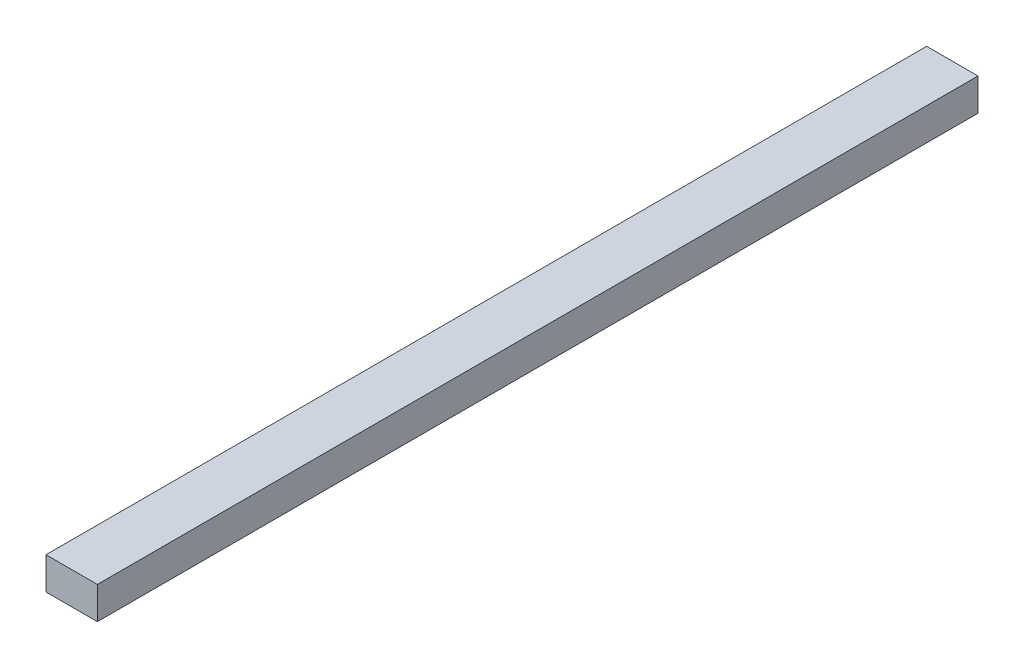
ISO-10303-21;
HEADER;
FILE_DESCRIPTION(('STEP AP214'),'2;1');
FILE_NAME('part.step','',(''),(''),'','','');
FILE_SCHEMA(('AUTOMOTIVE_DESIGN { 1 0 10303 214 1 1 1 1 }'));
ENDSEC;
DATA;
#1=APPLICATION_CONTEXT('core data for automotive mechanical design processes');
#2=APPLICATION_PROTOCOL_DEFINITION('international standard','automotive_design',2000,#1);
#3=PRODUCT_CONTEXT('',#1,'mechanical');
#4=PRODUCT('Part','Part','',(#3));
#5=PRODUCT_RELATED_PRODUCT_CATEGORY('part','',(#4));
#6=PRODUCT_DEFINITION_FORMATION('','',#4);
#7=PRODUCT_DEFINITION_CONTEXT('part definition',#1,'design');
#8=PRODUCT_DEFINITION('design','',#6,#7);
#9=PRODUCT_DEFINITION_SHAPE('','',#8);
#10=(LENGTH_UNIT() NAMED_UNIT(*) SI_UNIT(.MILLI.,.METRE.));
#11=(NAMED_UNIT(*) PLANE_ANGLE_UNIT() SI_UNIT($,.RADIAN.));
#12=(NAMED_UNIT(*) SI_UNIT($,.STERADIAN.) SOLID_ANGLE_UNIT());
#13=UNCERTAINTY_MEASURE_WITH_UNIT(LENGTH_MEASURE(1.E-05),#10,'distance_accuracy_value','');
#14=(GEOMETRIC_REPRESENTATION_CONTEXT(3) GLOBAL_UNCERTAINTY_ASSIGNED_CONTEXT((#13)) GLOBAL_UNIT_ASSIGNED_CONTEXT((#10,
#11,#12)) REPRESENTATION_CONTEXT('',''));
#15=CARTESIAN_POINT('',(0.,0.,0.));
#16=DIRECTION('',(0.,0.,1.));
#17=DIRECTION('',(1.,0.,0.));
#18=AXIS2_PLACEMENT_3D('',#15,#16,#17);
#19=CARTESIAN_POINT('',(35.,-22.,600.));
#20=DIRECTION('',(-1.,0.,0.));
#21=DIRECTION('',(0.,0.,1.));
#22=AXIS2_PLACEMENT_3D('',#19,#20,#21);
#23=PLANE('',#22);
#24=DIRECTION('',(0.,1.,0.));
#25=VECTOR('',#24,1.);
#26=CARTESIAN_POINT('',(35.,-22.,-600.));
#27=LINE('',#26,#25);
#28=CARTESIAN_POINT('',(35.,-22.,-600.));
#29=VERTEX_POINT('',#28);
#30=CARTESIAN_POINT('',(35.,22.,-600.));
#31=VERTEX_POINT('',#30);
#32=EDGE_CURVE('E94',#29,#31,#27,.T.);
#33=ORIENTED_EDGE('',*,*,#32,.T.);
#34=DIRECTION('',(0.,0.,-1.));
#35=VECTOR('',#34,1.);
#36=CARTESIAN_POINT('',(35.,22.,600.));
#37=LINE('',#36,#35);
#38=CARTESIAN_POINT('',(35.,22.,600.));
#39=VERTEX_POINT('',#38);
#40=EDGE_CURVE('E11',#39,#31,#37,.T.);
#41=ORIENTED_EDGE('',*,*,#40,.F.);
#42=DIRECTION('',(0.,1.,0.));
#43=VECTOR('',#42,1.);
#44=CARTESIAN_POINT('',(35.,-22.,600.));
#45=LINE('',#44,#43);
#46=CARTESIAN_POINT('',(35.,-22.,600.));
#47=VERTEX_POINT('',#46);
#48=EDGE_CURVE('E82',#47,#39,#45,.T.);
#49=ORIENTED_EDGE('',*,*,#48,.F.);
#50=DIRECTION('',(0.,0.,-1.));
#51=VECTOR('',#50,1.);
#52=CARTESIAN_POINT('',(35.,-22.,600.));
#53=LINE('',#52,#51);
#54=EDGE_CURVE('E90',#47,#29,#53,.T.);
#55=ORIENTED_EDGE('',*,*,#54,.T.);
#56=EDGE_LOOP('',(#33,#41,#49,#55));
#57=FACE_BOUND('',#56,.T.);
#58=ADVANCED_FACE('F31',(#57),#23,.F.);
#59=CARTESIAN_POINT('',(-35.,22.,600.));
#60=DIRECTION('',(0.,-1.,0.));
#61=DIRECTION('',(0.,0.,-1.));
#62=AXIS2_PLACEMENT_3D('',#59,#60,#61);
#63=PLANE('',#62);
#64=DIRECTION('',(-1.,0.,0.));
#65=VECTOR('',#64,1.);
#66=CARTESIAN_POINT('',(-35.,22.,-600.));
#67=LINE('',#66,#65);
#68=CARTESIAN_POINT('',(-35.,22.,-600.));
#69=VERTEX_POINT('',#68);
#70=EDGE_CURVE('E86',#31,#69,#67,.T.);
#71=ORIENTED_EDGE('',*,*,#70,.T.);
#72=DIRECTION('',(0.,0.,-1.));
#73=VECTOR('',#72,1.);
#74=CARTESIAN_POINT('',(-35.,22.,600.));
#75=LINE('',#74,#73);
#76=CARTESIAN_POINT('',(-35.,22.,600.));
#77=VERTEX_POINT('',#76);
#78=EDGE_CURVE('E39',#77,#69,#75,.T.);
#79=ORIENTED_EDGE('',*,*,#78,.F.);
#80=DIRECTION('',(-1.,0.,0.));
#81=VECTOR('',#80,1.);
#82=CARTESIAN_POINT('',(-35.,22.,600.));
#83=LINE('',#82,#81);
#84=EDGE_CURVE('E77',#39,#77,#83,.T.);
#85=ORIENTED_EDGE('',*,*,#84,.F.);
#86=ORIENTED_EDGE('',*,*,#40,.T.);
#87=EDGE_LOOP('',(#71,#79,#85,#86));
#88=FACE_BOUND('',#87,.T.);
#89=ADVANCED_FACE('F85',(#88),#63,.F.);
#90=CARTESIAN_POINT('',(-35.,-22.,600.));
#91=DIRECTION('',(1.,0.,0.));
#92=DIRECTION('',(0.,0.,-1.));
#93=AXIS2_PLACEMENT_3D('',#90,#91,#92);
#94=PLANE('',#93);
#95=DIRECTION('',(0.,-1.,0.));
#96=VECTOR('',#95,1.);
#97=CARTESIAN_POINT('',(-35.,-22.,-600.));
#98=LINE('',#97,#96);
#99=CARTESIAN_POINT('',(-35.,-22.,-600.));
#100=VERTEX_POINT('',#99);
#101=EDGE_CURVE('E64',#69,#100,#98,.T.);
#102=ORIENTED_EDGE('',*,*,#101,.T.);
#103=DIRECTION('',(0.,0.,-1.));
#104=VECTOR('',#103,1.);
#105=CARTESIAN_POINT('',(-35.,-22.,600.));
#106=LINE('',#105,#104);
#107=CARTESIAN_POINT('',(-35.,-22.,600.));
#108=VERTEX_POINT('',#107);
#109=EDGE_CURVE('E87',#108,#100,#106,.T.);
#110=ORIENTED_EDGE('',*,*,#109,.F.);
#111=DIRECTION('',(0.,-1.,0.));
#112=VECTOR('',#111,1.);
#113=CARTESIAN_POINT('',(-35.,-22.,600.));
#114=LINE('',#113,#112);
#115=EDGE_CURVE('E80',#77,#108,#114,.T.);
#116=ORIENTED_EDGE('',*,*,#115,.F.);
#117=ORIENTED_EDGE('',*,*,#78,.T.);
#118=EDGE_LOOP('',(#102,#110,#116,#117));
#119=FACE_BOUND('',#118,.T.);
#120=ADVANCED_FACE('F88',(#119),#94,.F.);
#121=CARTESIAN_POINT('',(-35.,-22.,600.));
#122=DIRECTION('',(0.,1.,0.));
#123=DIRECTION('',(0.,0.,1.));
#124=AXIS2_PLACEMENT_3D('',#121,#122,#123);
#125=PLANE('',#124);
#126=DIRECTION('',(1.,0.,0.));
#127=VECTOR('',#126,1.);
#128=CARTESIAN_POINT('',(-35.,-22.,-600.));
#129=LINE('',#128,#127);
#130=EDGE_CURVE('E70',#100,#29,#129,.T.);
#131=ORIENTED_EDGE('',*,*,#130,.T.);
#132=ORIENTED_EDGE('',*,*,#54,.F.);
#133=DIRECTION('',(1.,0.,0.));
#134=VECTOR('',#133,1.);
#135=CARTESIAN_POINT('',(-35.,-22.,600.));
#136=LINE('',#135,#134);
#137=EDGE_CURVE('E47',#108,#47,#136,.T.);
#138=ORIENTED_EDGE('',*,*,#137,.F.);
#139=ORIENTED_EDGE('',*,*,#109,.T.);
#140=EDGE_LOOP('',(#131,#132,#138,#139));
#141=FACE_BOUND('',#140,.T.);
#142=ADVANCED_FACE('F101',(#141),#125,.F.);
#143=CARTESIAN_POINT('',(35.,22.,600.));
#144=DIRECTION('',(0.,0.,-1.));
#145=DIRECTION('',(-1.,0.,0.));
#146=AXIS2_PLACEMENT_3D('',#143,#144,#145);
#147=PLANE('',#146);
#148=ORIENTED_EDGE('',*,*,#48,.T.);
#149=ORIENTED_EDGE('',*,*,#84,.T.);
#150=ORIENTED_EDGE('',*,*,#115,.T.);
#151=ORIENTED_EDGE('',*,*,#137,.T.);
#152=EDGE_LOOP('',(#148,#149,#150,#151));
#153=FACE_BOUND('',#152,.T.);
#154=ADVANCED_FACE('F78',(#153),#147,.F.);
#155=CARTESIAN_POINT('',(35.,22.,-600.));
#156=DIRECTION('',(0.,0.,-1.));
#157=DIRECTION('',(-1.,0.,0.));
#158=AXIS2_PLACEMENT_3D('',#155,#156,#157);
#159=PLANE('',#158);
#160=ORIENTED_EDGE('',*,*,#32,.F.);
#161=ORIENTED_EDGE('',*,*,#130,.F.);
#162=ORIENTED_EDGE('',*,*,#101,.F.);
#163=ORIENTED_EDGE('',*,*,#70,.F.);
#164=EDGE_LOOP('',(#160,#161,#162,#163));
#165=FACE_BOUND('',#164,.T.);
#166=ADVANCED_FACE('F104',(#165),#159,.T.);
#167=CLOSED_SHELL('',(#58,#89,#120,#142,#154,#166));
#168=MANIFOLD_SOLID_BREP('B2',#167);
#169=ADVANCED_BREP_SHAPE_REPRESENTATION('',(#18,#168),#14);
#170=SHAPE_DEFINITION_REPRESENTATION(#9,#169);
ENDSEC;
END-ISO-10303-21;
